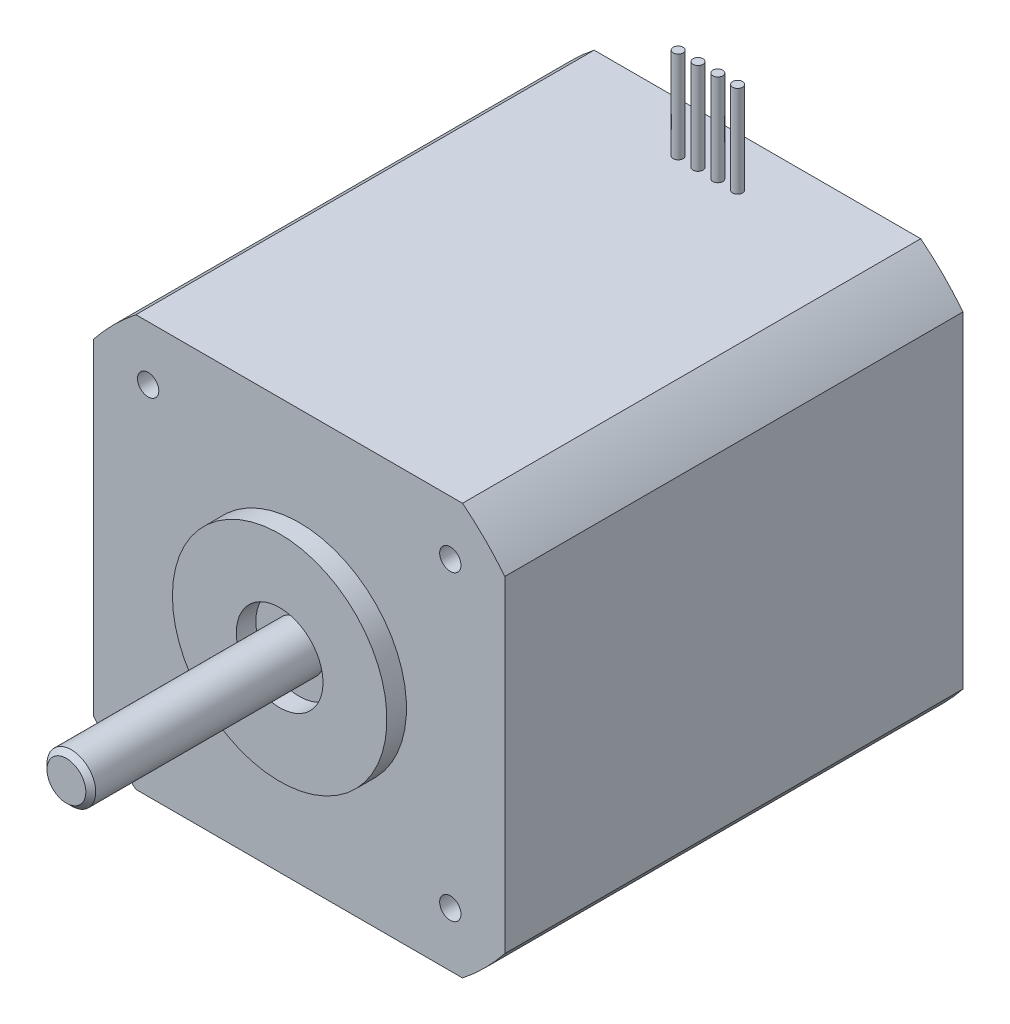
ISO-10303-21;
HEADER;
FILE_DESCRIPTION(('STEP AP214'),'2;1');
FILE_NAME('part.step','',(''),(''),'','','');
FILE_SCHEMA(('AUTOMOTIVE_DESIGN { 1 0 10303 214 1 1 1 1 }'));
ENDSEC;
DATA;
#1=APPLICATION_CONTEXT('core data for automotive mechanical design processes');
#2=APPLICATION_PROTOCOL_DEFINITION('international standard','automotive_design',2000,#1);
#3=PRODUCT_CONTEXT('',#1,'mechanical');
#4=PRODUCT('Part','Part','',(#3));
#5=PRODUCT_RELATED_PRODUCT_CATEGORY('part','',(#4));
#6=PRODUCT_DEFINITION_FORMATION('','',#4);
#7=PRODUCT_DEFINITION_CONTEXT('part definition',#1,'design');
#8=PRODUCT_DEFINITION('design','',#6,#7);
#9=PRODUCT_DEFINITION_SHAPE('','',#8);
#10=(LENGTH_UNIT() NAMED_UNIT(*) SI_UNIT(.MILLI.,.METRE.));
#11=(NAMED_UNIT(*) PLANE_ANGLE_UNIT() SI_UNIT($,.RADIAN.));
#12=(NAMED_UNIT(*) SI_UNIT($,.STERADIAN.) SOLID_ANGLE_UNIT());
#13=UNCERTAINTY_MEASURE_WITH_UNIT(LENGTH_MEASURE(1.E-05),#10,'distance_accuracy_value','');
#14=(GEOMETRIC_REPRESENTATION_CONTEXT(3) GLOBAL_UNCERTAINTY_ASSIGNED_CONTEXT((#13)) GLOBAL_UNIT_ASSIGNED_CONTEXT((#10,
#11,#12)) REPRESENTATION_CONTEXT('',''));
#15=CARTESIAN_POINT('',(0.,0.,0.));
#16=DIRECTION('',(0.,0.,1.));
#17=DIRECTION('',(1.,0.,0.));
#18=AXIS2_PLACEMENT_3D('',#15,#16,#17);
#19=CARTESIAN_POINT('',(0.,0.,70.866));
#20=DIRECTION('',(0.,0.,-1.));
#21=DIRECTION('',(-1.,0.,0.));
#22=AXIS2_PLACEMENT_3D('',#19,#20,#21);
#23=PLANE('',#22);
#24=CARTESIAN_POINT('',(0.,0.,70.866000000251));
#25=DIRECTION('',(0.,0.,-1.));
#26=DIRECTION('',(-1.,0.,0.));
#27=AXIS2_PLACEMENT_3D('',#24,#25,#26);
#28=CIRCLE('',#27,1.99136000026101);
#29=CARTESIAN_POINT('',(-1.99136000026101,0.,70.866000000251));
#30=VERTEX_POINT('',#29);
#31=EDGE_CURVE('E19',#30,#30,#28,.T.);
#32=ORIENTED_EDGE('',*,*,#31,.F.);
#33=EDGE_LOOP('',(#32));
#34=FACE_BOUND('',#33,.T.);
#35=ADVANCED_FACE('F16',(#34),#23,.F.);
#36=CARTESIAN_POINT('',(0.,0.,70.3579999998283));
#37=DIRECTION('',(0.,0.,-1.));
#38=DIRECTION('',(-1.,0.,0.));
#39=AXIS2_PLACEMENT_3D('',#36,#37,#38);
#40=CONICAL_SURFACE('',#39,2.49935999977424,0.785398162502276);
#41=ORIENTED_EDGE('',*,*,#31,.T.);
#42=EDGE_LOOP('',(#41));
#43=FACE_BOUND('',#42,.T.);
#44=CARTESIAN_POINT('',(0.,0.,70.358));
#45=DIRECTION('',(0.,0.,-1.));
#46=DIRECTION('',(-1.,0.,0.));
#47=AXIS2_PLACEMENT_3D('',#44,#45,#46);
#48=CIRCLE('',#47,2.49936);
#49=CARTESIAN_POINT('',(-2.49936,0.,70.358));
#50=VERTEX_POINT('',#49);
#51=EDGE_CURVE('E120',#50,#50,#48,.T.);
#52=ORIENTED_EDGE('',*,*,#51,.F.);
#53=EDGE_LOOP('',(#52));
#54=FACE_BOUND('',#53,.T.);
#55=ADVANCED_FACE('F210',(#43,#54),#40,.T.);
#56=CARTESIAN_POINT('',(0.,0.,46.99));
#57=DIRECTION('',(0.,0.,-1.));
#58=DIRECTION('',(-1.,0.,0.));
#59=AXIS2_PLACEMENT_3D('',#56,#57,#58);
#60=CYLINDRICAL_SURFACE('',#59,2.49936);
#61=ORIENTED_EDGE('',*,*,#51,.T.);
#62=EDGE_LOOP('',(#61));
#63=FACE_BOUND('',#62,.T.);
#64=CARTESIAN_POINT('',(0.,0.,46.99));
#65=DIRECTION('',(0.,0.,-1.));
#66=DIRECTION('',(-1.,0.,0.));
#67=AXIS2_PLACEMENT_3D('',#64,#65,#66);
#68=CIRCLE('',#67,2.49936);
#69=CARTESIAN_POINT('',(-2.49936,0.,46.99));
#70=VERTEX_POINT('',#69);
#71=EDGE_CURVE('E122',#70,#70,#68,.T.);
#72=ORIENTED_EDGE('',*,*,#71,.F.);
#73=EDGE_LOOP('',(#72));
#74=FACE_BOUND('',#73,.T.);
#75=ADVANCED_FACE('F208',(#63,#74),#60,.T.);
#76=CARTESIAN_POINT('',(0.,0.,46.99));
#77=DIRECTION('',(0.,0.,1.));
#78=DIRECTION('',(1.,0.,0.));
#79=AXIS2_PLACEMENT_3D('',#76,#77,#78);
#80=PLANE('',#79);
#81=ORIENTED_EDGE('',*,*,#71,.T.);
#82=EDGE_LOOP('',(#81));
#83=FACE_BOUND('',#82,.T.);
#84=CARTESIAN_POINT('',(0.,0.,46.99));
#85=DIRECTION('',(0.,0.,-1.));
#86=DIRECTION('',(-1.,0.,0.));
#87=AXIS2_PLACEMENT_3D('',#84,#85,#86);
#88=CIRCLE('',#87,4.445);
#89=CARTESIAN_POINT('',(-4.445,0.,46.99));
#90=VERTEX_POINT('',#89);
#91=EDGE_CURVE('E200',#90,#90,#88,.F.);
#92=ORIENTED_EDGE('',*,*,#91,.T.);
#93=EDGE_LOOP('',(#92));
#94=FACE_BOUND('',#93,.T.);
#95=ADVANCED_FACE('F205',(#83,#94),#80,.T.);
#96=CARTESIAN_POINT('',(0.,0.,46.99));
#97=DIRECTION('',(0.,0.,-1.));
#98=DIRECTION('',(-1.,0.,0.));
#99=AXIS2_PLACEMENT_3D('',#96,#97,#98);
#100=CYLINDRICAL_SURFACE('',#99,4.445);
#101=CARTESIAN_POINT('',(0.,0.,48.9966));
#102=DIRECTION('',(0.,0.,-1.));
#103=DIRECTION('',(-1.,0.,0.));
#104=AXIS2_PLACEMENT_3D('',#101,#102,#103);
#105=CIRCLE('',#104,4.445);
#106=CARTESIAN_POINT('',(-4.445,0.,48.9966));
#107=VERTEX_POINT('',#106);
#108=EDGE_CURVE('E197',#107,#107,#105,.F.);
#109=ORIENTED_EDGE('',*,*,#108,.T.);
#110=EDGE_LOOP('',(#109));
#111=FACE_BOUND('',#110,.T.);
#112=ORIENTED_EDGE('',*,*,#91,.F.);
#113=EDGE_LOOP('',(#112));
#114=FACE_BOUND('',#113,.T.);
#115=ADVANCED_FACE('F218',(#111,#114),#100,.F.);
#116=CARTESIAN_POINT('',(-15.494,15.494,36.83));
#117=DIRECTION('',(0.,0.,-1.));
#118=DIRECTION('',(-1.,0.,0.));
#119=AXIS2_PLACEMENT_3D('',#116,#117,#118);
#120=PLANE('',#119);
#121=CARTESIAN_POINT('',(-15.494,15.494,36.83));
#122=DIRECTION('',(0.,0.,1.));
#123=DIRECTION('',(1.,0.,0.));
#124=AXIS2_PLACEMENT_3D('',#121,#122,#123);
#125=CIRCLE('',#124,1.0922);
#126=CARTESIAN_POINT('',(-14.4018,15.494,36.83));
#127=VERTEX_POINT('',#126);
#128=EDGE_CURVE('E194',#127,#127,#125,.T.);
#129=ORIENTED_EDGE('',*,*,#128,.T.);
#130=EDGE_LOOP('',(#129));
#131=FACE_BOUND('',#130,.T.);
#132=ADVANCED_FACE('F335',(#131),#120,.F.);
#133=CARTESIAN_POINT('',(-15.494,-15.494,36.83));
#134=DIRECTION('',(0.,0.,-1.));
#135=DIRECTION('',(-1.,0.,0.));
#136=AXIS2_PLACEMENT_3D('',#133,#134,#135);
#137=PLANE('',#136);
#138=CARTESIAN_POINT('',(-15.494,-15.494,36.83));
#139=DIRECTION('',(0.,0.,1.));
#140=DIRECTION('',(1.,0.,0.));
#141=AXIS2_PLACEMENT_3D('',#138,#139,#140);
#142=CIRCLE('',#141,1.0922);
#143=CARTESIAN_POINT('',(-14.4018,-15.494,36.83));
#144=VERTEX_POINT('',#143);
#145=EDGE_CURVE('E191',#144,#144,#142,.T.);
#146=ORIENTED_EDGE('',*,*,#145,.T.);
#147=EDGE_LOOP('',(#146));
#148=FACE_BOUND('',#147,.T.);
#149=ADVANCED_FACE('F331',(#148),#137,.F.);
#150=CARTESIAN_POINT('',(15.494,-15.494,36.83));
#151=DIRECTION('',(0.,0.,-1.));
#152=DIRECTION('',(-1.,0.,0.));
#153=AXIS2_PLACEMENT_3D('',#150,#151,#152);
#154=PLANE('',#153);
#155=CARTESIAN_POINT('',(15.494,-15.494,36.83));
#156=DIRECTION('',(0.,0.,1.));
#157=DIRECTION('',(1.,0.,0.));
#158=AXIS2_PLACEMENT_3D('',#155,#156,#157);
#159=CIRCLE('',#158,1.0922);
#160=CARTESIAN_POINT('',(16.5862,-15.494,36.83));
#161=VERTEX_POINT('',#160);
#162=EDGE_CURVE('E188',#161,#161,#159,.T.);
#163=ORIENTED_EDGE('',*,*,#162,.T.);
#164=EDGE_LOOP('',(#163));
#165=FACE_BOUND('',#164,.T.);
#166=ADVANCED_FACE('F327',(#165),#154,.F.);
#167=CARTESIAN_POINT('',(15.494,15.494,36.83));
#168=DIRECTION('',(0.,0.,-1.));
#169=DIRECTION('',(-1.,0.,0.));
#170=AXIS2_PLACEMENT_3D('',#167,#168,#169);
#171=PLANE('',#170);
#172=CARTESIAN_POINT('',(15.494,15.494,36.83));
#173=DIRECTION('',(0.,0.,1.));
#174=DIRECTION('',(1.,0.,0.));
#175=AXIS2_PLACEMENT_3D('',#172,#173,#174);
#176=CIRCLE('',#175,1.0922);
#177=CARTESIAN_POINT('',(16.5862,15.494,36.83));
#178=VERTEX_POINT('',#177);
#179=EDGE_CURVE('E185',#178,#178,#176,.T.);
#180=ORIENTED_EDGE('',*,*,#179,.T.);
#181=EDGE_LOOP('',(#180));
#182=FACE_BOUND('',#181,.T.);
#183=ADVANCED_FACE('F323',(#182),#171,.F.);
#184=CARTESIAN_POINT('',(0.,0.,48.9966));
#185=DIRECTION('',(0.,0.,-1.));
#186=DIRECTION('',(-1.,0.,0.));
#187=AXIS2_PLACEMENT_3D('',#184,#185,#186);
#188=PLANE('',#187);
#189=ORIENTED_EDGE('',*,*,#108,.F.);
#190=EDGE_LOOP('',(#189));
#191=FACE_BOUND('',#190,.T.);
#192=CARTESIAN_POINT('',(0.,0.,48.9966));
#193=DIRECTION('',(0.,0.,-1.));
#194=DIRECTION('',(-1.,0.,0.));
#195=AXIS2_PLACEMENT_3D('',#192,#193,#194);
#196=CIRCLE('',#195,10.9982);
#197=CARTESIAN_POINT('',(-10.9982,0.,48.9966));
#198=VERTEX_POINT('',#197);
#199=EDGE_CURVE('E182',#198,#198,#196,.T.);
#200=ORIENTED_EDGE('',*,*,#199,.F.);
#201=EDGE_LOOP('',(#200));
#202=FACE_BOUND('',#201,.T.);
#203=ADVANCED_FACE('F319',(#191,#202),#188,.F.);
#204=CARTESIAN_POINT('',(-1.016,30.48,5.08));
#205=DIRECTION('',(0.,-1.,0.));
#206=DIRECTION('',(0.,0.,-1.));
#207=AXIS2_PLACEMENT_3D('',#204,#205,#206);
#208=PLANE('',#207);
#209=CARTESIAN_POINT('',(-1.016,30.48,5.08));
#210=DIRECTION('',(0.,-1.,0.));
#211=DIRECTION('',(0.,0.,-1.));
#212=AXIS2_PLACEMENT_3D('',#209,#210,#211);
#213=CIRCLE('',#212,0.508);
#214=CARTESIAN_POINT('',(-1.016,30.48,4.572));
#215=VERTEX_POINT('',#214);
#216=EDGE_CURVE('E179',#215,#215,#213,.T.);
#217=ORIENTED_EDGE('',*,*,#216,.F.);
#218=EDGE_LOOP('',(#217));
#219=FACE_BOUND('',#218,.T.);
#220=ADVANCED_FACE('F315',(#219),#208,.F.);
#221=CARTESIAN_POINT('',(3.048,30.48,5.08));
#222=DIRECTION('',(0.,-1.,0.));
#223=DIRECTION('',(0.,0.,-1.));
#224=AXIS2_PLACEMENT_3D('',#221,#222,#223);
#225=PLANE('',#224);
#226=CARTESIAN_POINT('',(3.048,30.48,5.08));
#227=DIRECTION('',(0.,-1.,0.));
#228=DIRECTION('',(0.,0.,-1.));
#229=AXIS2_PLACEMENT_3D('',#226,#227,#228);
#230=CIRCLE('',#229,0.508);
#231=CARTESIAN_POINT('',(3.048,30.48,4.572));
#232=VERTEX_POINT('',#231);
#233=EDGE_CURVE('E176',#232,#232,#230,.T.);
#234=ORIENTED_EDGE('',*,*,#233,.F.);
#235=EDGE_LOOP('',(#234));
#236=FACE_BOUND('',#235,.T.);
#237=ADVANCED_FACE('F311',(#236),#225,.F.);
#238=CARTESIAN_POINT('',(1.016,30.48,5.08));
#239=DIRECTION('',(0.,-1.,0.));
#240=DIRECTION('',(0.,0.,-1.));
#241=AXIS2_PLACEMENT_3D('',#238,#239,#240);
#242=PLANE('',#241);
#243=CARTESIAN_POINT('',(1.016,30.48,5.08));
#244=DIRECTION('',(0.,-1.,0.));
#245=DIRECTION('',(0.,0.,-1.));
#246=AXIS2_PLACEMENT_3D('',#243,#244,#245);
#247=CIRCLE('',#246,0.508);
#248=CARTESIAN_POINT('',(1.016,30.48,4.572));
#249=VERTEX_POINT('',#248);
#250=EDGE_CURVE('E173',#249,#249,#247,.T.);
#251=ORIENTED_EDGE('',*,*,#250,.F.);
#252=EDGE_LOOP('',(#251));
#253=FACE_BOUND('',#252,.T.);
#254=ADVANCED_FACE('F307',(#253),#242,.F.);
#255=CARTESIAN_POINT('',(-3.048,30.48,5.08));
#256=DIRECTION('',(0.,-1.,0.));
#257=DIRECTION('',(0.,0.,-1.));
#258=AXIS2_PLACEMENT_3D('',#255,#256,#257);
#259=PLANE('',#258);
#260=CARTESIAN_POINT('',(-3.048,30.48,5.08));
#261=DIRECTION('',(0.,-1.,0.));
#262=DIRECTION('',(0.,0.,-1.));
#263=AXIS2_PLACEMENT_3D('',#260,#261,#262);
#264=CIRCLE('',#263,0.508);
#265=CARTESIAN_POINT('',(-3.048,30.48,4.572));
#266=VERTEX_POINT('',#265);
#267=EDGE_CURVE('E170',#266,#266,#264,.T.);
#268=ORIENTED_EDGE('',*,*,#267,.F.);
#269=EDGE_LOOP('',(#268));
#270=FACE_BOUND('',#269,.T.);
#271=ADVANCED_FACE('F303',(#270),#259,.F.);
#272=CARTESIAN_POINT('',(-15.494,15.494,49.53));
#273=DIRECTION('',(0.,0.,1.));
#274=DIRECTION('',(1.,0.,0.));
#275=AXIS2_PLACEMENT_3D('',#272,#273,#274);
#276=CYLINDRICAL_SURFACE('',#275,1.0922);
#277=ORIENTED_EDGE('',*,*,#128,.F.);
#278=EDGE_LOOP('',(#277));
#279=FACE_BOUND('',#278,.T.);
#280=CARTESIAN_POINT('',(-15.494,15.494,46.99));
#281=DIRECTION('',(0.,0.,1.));
#282=DIRECTION('',(1.,0.,0.));
#283=AXIS2_PLACEMENT_3D('',#280,#281,#282);
#284=CIRCLE('',#283,1.0922);
#285=CARTESIAN_POINT('',(-14.4018,15.494,46.99));
#286=VERTEX_POINT('',#285);
#287=EDGE_CURVE('E167',#286,#286,#284,.F.);
#288=ORIENTED_EDGE('',*,*,#287,.F.);
#289=EDGE_LOOP('',(#288));
#290=FACE_BOUND('',#289,.T.);
#291=ADVANCED_FACE('F299',(#279,#290),#276,.F.);
#292=CARTESIAN_POINT('',(-15.494,-15.494,49.53));
#293=DIRECTION('',(0.,0.,1.));
#294=DIRECTION('',(1.,0.,0.));
#295=AXIS2_PLACEMENT_3D('',#292,#293,#294);
#296=CYLINDRICAL_SURFACE('',#295,1.0922);
#297=ORIENTED_EDGE('',*,*,#145,.F.);
#298=EDGE_LOOP('',(#297));
#299=FACE_BOUND('',#298,.T.);
#300=CARTESIAN_POINT('',(-15.494,-15.494,46.99));
#301=DIRECTION('',(0.,0.,1.));
#302=DIRECTION('',(1.,0.,0.));
#303=AXIS2_PLACEMENT_3D('',#300,#301,#302);
#304=CIRCLE('',#303,1.0922);
#305=CARTESIAN_POINT('',(-14.4018,-15.494,46.99));
#306=VERTEX_POINT('',#305);
#307=EDGE_CURVE('E164',#306,#306,#304,.F.);
#308=ORIENTED_EDGE('',*,*,#307,.F.);
#309=EDGE_LOOP('',(#308));
#310=FACE_BOUND('',#309,.T.);
#311=ADVANCED_FACE('F295',(#299,#310),#296,.F.);
#312=CARTESIAN_POINT('',(15.494,-15.494,49.53));
#313=DIRECTION('',(0.,0.,1.));
#314=DIRECTION('',(1.,0.,0.));
#315=AXIS2_PLACEMENT_3D('',#312,#313,#314);
#316=CYLINDRICAL_SURFACE('',#315,1.0922);
#317=ORIENTED_EDGE('',*,*,#162,.F.);
#318=EDGE_LOOP('',(#317));
#319=FACE_BOUND('',#318,.T.);
#320=CARTESIAN_POINT('',(15.494,-15.494,46.99));
#321=DIRECTION('',(0.,0.,1.));
#322=DIRECTION('',(1.,0.,0.));
#323=AXIS2_PLACEMENT_3D('',#320,#321,#322);
#324=CIRCLE('',#323,1.0922);
#325=CARTESIAN_POINT('',(16.5862,-15.494,46.99));
#326=VERTEX_POINT('',#325);
#327=EDGE_CURVE('E161',#326,#326,#324,.F.);
#328=ORIENTED_EDGE('',*,*,#327,.F.);
#329=EDGE_LOOP('',(#328));
#330=FACE_BOUND('',#329,.T.);
#331=ADVANCED_FACE('F291',(#319,#330),#316,.F.);
#332=CARTESIAN_POINT('',(15.494,15.494,49.53));
#333=DIRECTION('',(0.,0.,1.));
#334=DIRECTION('',(1.,0.,0.));
#335=AXIS2_PLACEMENT_3D('',#332,#333,#334);
#336=CYLINDRICAL_SURFACE('',#335,1.0922);
#337=ORIENTED_EDGE('',*,*,#179,.F.);
#338=EDGE_LOOP('',(#337));
#339=FACE_BOUND('',#338,.T.);
#340=CARTESIAN_POINT('',(15.494,15.494,46.99));
#341=DIRECTION('',(0.,0.,1.));
#342=DIRECTION('',(1.,0.,0.));
#343=AXIS2_PLACEMENT_3D('',#340,#341,#342);
#344=CIRCLE('',#343,1.0922);
#345=CARTESIAN_POINT('',(16.5862,15.494,46.99));
#346=VERTEX_POINT('',#345);
#347=EDGE_CURVE('E158',#346,#346,#344,.F.);
#348=ORIENTED_EDGE('',*,*,#347,.F.);
#349=EDGE_LOOP('',(#348));
#350=FACE_BOUND('',#349,.T.);
#351=ADVANCED_FACE('F287',(#339,#350),#336,.F.);
#352=CARTESIAN_POINT('',(0.,0.,46.99));
#353=DIRECTION('',(0.,0.,-1.));
#354=DIRECTION('',(-1.,0.,0.));
#355=AXIS2_PLACEMENT_3D('',#352,#353,#354);
#356=CYLINDRICAL_SURFACE('',#355,10.9982);
#357=ORIENTED_EDGE('',*,*,#199,.T.);
#358=EDGE_LOOP('',(#357));
#359=FACE_BOUND('',#358,.T.);
#360=CARTESIAN_POINT('',(0.,0.,46.99));
#361=DIRECTION('',(0.,0.,-1.));
#362=DIRECTION('',(-1.,0.,0.));
#363=AXIS2_PLACEMENT_3D('',#360,#361,#362);
#364=CIRCLE('',#363,10.9982);
#365=CARTESIAN_POINT('',(-10.9982,0.,46.99));
#366=VERTEX_POINT('',#365);
#367=EDGE_CURVE('E99',#366,#366,#364,.T.);
#368=ORIENTED_EDGE('',*,*,#367,.F.);
#369=EDGE_LOOP('',(#368));
#370=FACE_BOUND('',#369,.T.);
#371=ADVANCED_FACE('F283',(#359,#370),#356,.T.);
#372=CARTESIAN_POINT('',(-1.016,0.,5.08));
#373=DIRECTION('',(0.,-1.,0.));
#374=DIRECTION('',(0.,0.,-1.));
#375=AXIS2_PLACEMENT_3D('',#372,#373,#374);
#376=CYLINDRICAL_SURFACE('',#375,0.508);
#377=ORIENTED_EDGE('',*,*,#216,.T.);
#378=EDGE_LOOP('',(#377));
#379=FACE_BOUND('',#378,.T.);
#380=CARTESIAN_POINT('',(-1.016,21.082,5.08));
#381=DIRECTION('',(0.,-1.,0.));
#382=DIRECTION('',(0.,0.,-1.));
#383=AXIS2_PLACEMENT_3D('',#380,#381,#382);
#384=CIRCLE('',#383,0.508);
#385=CARTESIAN_POINT('',(-1.016,21.082,4.572));
#386=VERTEX_POINT('',#385);
#387=EDGE_CURVE('E116',#386,#386,#384,.T.);
#388=ORIENTED_EDGE('',*,*,#387,.F.);
#389=EDGE_LOOP('',(#388));
#390=FACE_BOUND('',#389,.T.);
#391=ADVANCED_FACE('F279',(#379,#390),#376,.T.);
#392=CARTESIAN_POINT('',(3.048,0.,5.08));
#393=DIRECTION('',(0.,-1.,0.));
#394=DIRECTION('',(0.,0.,-1.));
#395=AXIS2_PLACEMENT_3D('',#392,#393,#394);
#396=CYLINDRICAL_SURFACE('',#395,0.508);
#397=ORIENTED_EDGE('',*,*,#233,.T.);
#398=EDGE_LOOP('',(#397));
#399=FACE_BOUND('',#398,.T.);
#400=CARTESIAN_POINT('',(3.048,21.082,5.08));
#401=DIRECTION('',(0.,-1.,0.));
#402=DIRECTION('',(0.,0.,-1.));
#403=AXIS2_PLACEMENT_3D('',#400,#401,#402);
#404=CIRCLE('',#403,0.508);
#405=CARTESIAN_POINT('',(3.048,21.082,4.572));
#406=VERTEX_POINT('',#405);
#407=EDGE_CURVE('E149',#406,#406,#404,.T.);
#408=ORIENTED_EDGE('',*,*,#407,.F.);
#409=EDGE_LOOP('',(#408));
#410=FACE_BOUND('',#409,.T.);
#411=ADVANCED_FACE('F275',(#399,#410),#396,.T.);
#412=CARTESIAN_POINT('',(1.016,0.,5.08));
#413=DIRECTION('',(0.,-1.,0.));
#414=DIRECTION('',(0.,0.,-1.));
#415=AXIS2_PLACEMENT_3D('',#412,#413,#414);
#416=CYLINDRICAL_SURFACE('',#415,0.508);
#417=ORIENTED_EDGE('',*,*,#250,.T.);
#418=EDGE_LOOP('',(#417));
#419=FACE_BOUND('',#418,.T.);
#420=CARTESIAN_POINT('',(1.016,21.082,5.08));
#421=DIRECTION('',(0.,-1.,0.));
#422=DIRECTION('',(0.,0.,-1.));
#423=AXIS2_PLACEMENT_3D('',#420,#421,#422);
#424=CIRCLE('',#423,0.508);
#425=CARTESIAN_POINT('',(1.016,21.082,4.572));
#426=VERTEX_POINT('',#425);
#427=EDGE_CURVE('E146',#426,#426,#424,.T.);
#428=ORIENTED_EDGE('',*,*,#427,.F.);
#429=EDGE_LOOP('',(#428));
#430=FACE_BOUND('',#429,.T.);
#431=ADVANCED_FACE('F271',(#419,#430),#416,.T.);
#432=CARTESIAN_POINT('',(-3.048,0.,5.08));
#433=DIRECTION('',(0.,-1.,0.));
#434=DIRECTION('',(0.,0.,-1.));
#435=AXIS2_PLACEMENT_3D('',#432,#433,#434);
#436=CYLINDRICAL_SURFACE('',#435,0.508);
#437=ORIENTED_EDGE('',*,*,#267,.T.);
#438=EDGE_LOOP('',(#437));
#439=FACE_BOUND('',#438,.T.);
#440=CARTESIAN_POINT('',(-3.048,21.082,5.08));
#441=DIRECTION('',(0.,-1.,0.));
#442=DIRECTION('',(0.,0.,-1.));
#443=AXIS2_PLACEMENT_3D('',#440,#441,#442);
#444=CIRCLE('',#443,0.508);
#445=CARTESIAN_POINT('',(-3.048,21.082,4.572));
#446=VERTEX_POINT('',#445);
#447=EDGE_CURVE('E143',#446,#446,#444,.T.);
#448=ORIENTED_EDGE('',*,*,#447,.F.);
#449=EDGE_LOOP('',(#448));
#450=FACE_BOUND('',#449,.T.);
#451=ADVANCED_FACE('F267',(#439,#450),#436,.T.);
#452=CARTESIAN_POINT('',(0.,0.,46.99));
#453=DIRECTION('',(0.,0.,1.));
#454=DIRECTION('',(1.,0.,0.));
#455=AXIS2_PLACEMENT_3D('',#452,#453,#454);
#456=PLANE('',#455);
#457=ORIENTED_EDGE('',*,*,#367,.T.);
#458=EDGE_LOOP('',(#457));
#459=FACE_BOUND('',#458,.T.);
#460=ORIENTED_EDGE('',*,*,#347,.T.);
#461=EDGE_LOOP('',(#460));
#462=FACE_BOUND('',#461,.T.);
#463=ORIENTED_EDGE('',*,*,#327,.T.);
#464=EDGE_LOOP('',(#463));
#465=FACE_BOUND('',#464,.T.);
#466=ORIENTED_EDGE('',*,*,#307,.T.);
#467=EDGE_LOOP('',(#466));
#468=FACE_BOUND('',#467,.T.);
#469=ORIENTED_EDGE('',*,*,#287,.T.);
#470=EDGE_LOOP('',(#469));
#471=FACE_BOUND('',#470,.T.);
#472=CARTESIAN_POINT('',(0.,0.,46.99));
#473=DIRECTION('',(0.,0.,-1.));
#474=DIRECTION('',(-1.,0.,0.));
#475=AXIS2_PLACEMENT_3D('',#472,#473,#474);
#476=CIRCLE('',#475,26.924);
#477=CARTESIAN_POINT('',(-21.082,16.746672863587,46.99));
#478=VERTEX_POINT('',#477);
#479=CARTESIAN_POINT('',(-16.746672863587,21.082,46.99));
#480=VERTEX_POINT('',#479);
#481=EDGE_CURVE('E141',#478,#480,#476,.T.);
#482=ORIENTED_EDGE('',*,*,#481,.F.);
#483=DIRECTION('',(0.,1.,0.));
#484=VECTOR('',#483,1.);
#485=CARTESIAN_POINT('',(-21.082,17.907,46.99));
#486=LINE('',#485,#484);
#487=CARTESIAN_POINT('',(-21.082,-16.746672863587,46.99));
#488=VERTEX_POINT('',#487);
#489=EDGE_CURVE('E109',#488,#478,#486,.T.);
#490=ORIENTED_EDGE('',*,*,#489,.F.);
#491=CARTESIAN_POINT('',(0.,0.,46.99));
#492=DIRECTION('',(0.,0.,-1.));
#493=DIRECTION('',(-1.,0.,0.));
#494=AXIS2_PLACEMENT_3D('',#491,#492,#493);
#495=CIRCLE('',#494,26.924);
#496=CARTESIAN_POINT('',(-16.746672863587,-21.082,46.99));
#497=VERTEX_POINT('',#496);
#498=EDGE_CURVE('E95',#497,#488,#495,.T.);
#499=ORIENTED_EDGE('',*,*,#498,.F.);
#500=DIRECTION('',(1.,0.,0.));
#501=VECTOR('',#500,1.);
#502=CARTESIAN_POINT('',(-17.907,-21.082,46.99));
#503=LINE('',#502,#501);
#504=CARTESIAN_POINT('',(16.746672863587,-21.082,46.99));
#505=VERTEX_POINT('',#504);
#506=EDGE_CURVE('E89',#505,#497,#503,.F.);
#507=ORIENTED_EDGE('',*,*,#506,.F.);
#508=CARTESIAN_POINT('',(0.,0.,46.99));
#509=DIRECTION('',(0.,0.,-1.));
#510=DIRECTION('',(-1.,0.,0.));
#511=AXIS2_PLACEMENT_3D('',#508,#509,#510);
#512=CIRCLE('',#511,26.924);
#513=CARTESIAN_POINT('',(21.082,-16.746672863587,46.99));
#514=VERTEX_POINT('',#513);
#515=EDGE_CURVE('E79',#514,#505,#512,.T.);
#516=ORIENTED_EDGE('',*,*,#515,.F.);
#517=DIRECTION('',(0.,1.,0.));
#518=VECTOR('',#517,1.);
#519=CARTESIAN_POINT('',(21.082,-17.907,46.99));
#520=LINE('',#519,#518);
#521=CARTESIAN_POINT('',(21.082,16.746672863587,46.99));
#522=VERTEX_POINT('',#521);
#523=EDGE_CURVE('E105',#522,#514,#520,.F.);
#524=ORIENTED_EDGE('',*,*,#523,.F.);
#525=CARTESIAN_POINT('',(0.,0.,46.99));
#526=DIRECTION('',(0.,0.,-1.));
#527=DIRECTION('',(-1.,0.,0.));
#528=AXIS2_PLACEMENT_3D('',#525,#526,#527);
#529=CIRCLE('',#528,26.924);
#530=CARTESIAN_POINT('',(16.746672863587,21.082,46.99));
#531=VERTEX_POINT('',#530);
#532=EDGE_CURVE('E119',#531,#522,#529,.T.);
#533=ORIENTED_EDGE('',*,*,#532,.F.);
#534=DIRECTION('',(1.,0.,0.));
#535=VECTOR('',#534,1.);
#536=CARTESIAN_POINT('',(17.907,21.082,46.99));
#537=LINE('',#536,#535);
#538=EDGE_CURVE('E113',#480,#531,#537,.T.);
#539=ORIENTED_EDGE('',*,*,#538,.F.);
#540=EDGE_LOOP('',(#482,#490,#499,#507,#516,#524,#533,#539));
#541=FACE_BOUND('',#540,.T.);
#542=ADVANCED_FACE('F93',(#459,#462,#465,#468,#471,#541),#456,.T.);
#543=CARTESIAN_POINT('',(0.,0.,0.254));
#544=DIRECTION('',(0.,0.,1.));
#545=DIRECTION('',(1.,0.,0.));
#546=AXIS2_PLACEMENT_3D('',#543,#544,#545);
#547=PLANE('',#546);
#548=CARTESIAN_POINT('',(0.,0.,0.253999999999997));
#549=DIRECTION('',(0.,0.,1.));
#550=DIRECTION('',(1.,0.,0.));
#551=AXIS2_PLACEMENT_3D('',#548,#549,#550);
#552=CIRCLE('',#551,4.445);
#553=CARTESIAN_POINT('',(4.445,0.,0.253999999999997));
#554=VERTEX_POINT('',#553);
#555=EDGE_CURVE('E136',#554,#554,#552,.F.);
#556=ORIENTED_EDGE('',*,*,#555,.T.);
#557=EDGE_LOOP('',(#556));
#558=FACE_BOUND('',#557,.T.);
#559=ADVANCED_FACE('F261',(#558),#547,.F.);
#560=CARTESIAN_POINT('',(-17.907,-21.082,46.99));
#561=DIRECTION('',(0.,-1.,0.));
#562=DIRECTION('',(0.,0.,-1.));
#563=AXIS2_PLACEMENT_3D('',#560,#561,#562);
#564=PLANE('',#563);
#565=DIRECTION('',(0.,0.,-1.));
#566=VECTOR('',#565,1.);
#567=CARTESIAN_POINT('',(16.746672863587,-21.082,0.));
#568=LINE('',#567,#566);
#569=CARTESIAN_POINT('',(16.746672863587,-21.082,0.));
#570=VERTEX_POINT('',#569);
#571=EDGE_CURVE('E86',#505,#570,#568,.T.);
#572=ORIENTED_EDGE('',*,*,#571,.F.);
#573=ORIENTED_EDGE('',*,*,#506,.T.);
#574=DIRECTION('',(0.,0.,-1.));
#575=VECTOR('',#574,1.);
#576=CARTESIAN_POINT('',(-16.746672863587,-21.082,0.));
#577=LINE('',#576,#575);
#578=CARTESIAN_POINT('',(-16.746672863587,-21.082,0.));
#579=VERTEX_POINT('',#578);
#580=EDGE_CURVE('E140',#579,#497,#577,.F.);
#581=ORIENTED_EDGE('',*,*,#580,.F.);
#582=DIRECTION('',(1.,0.,0.));
#583=VECTOR('',#582,1.);
#584=CARTESIAN_POINT('',(0.,-21.082,0.));
#585=LINE('',#584,#583);
#586=EDGE_CURVE('E103',#579,#570,#585,.T.);
#587=ORIENTED_EDGE('',*,*,#586,.T.);
#588=EDGE_LOOP('',(#572,#573,#581,#587));
#589=FACE_BOUND('',#588,.T.);
#590=ADVANCED_FACE('F102',(#589),#564,.T.);
#591=CARTESIAN_POINT('',(0.,0.,0.));
#592=DIRECTION('',(0.,0.,-1.));
#593=DIRECTION('',(-1.,0.,0.));
#594=AXIS2_PLACEMENT_3D('',#591,#592,#593);
#595=CYLINDRICAL_SURFACE('',#594,26.924);
#596=ORIENTED_EDGE('',*,*,#571,.T.);
#597=CARTESIAN_POINT('',(0.,0.,0.));
#598=DIRECTION('',(0.,0.,-1.));
#599=DIRECTION('',(-1.,0.,0.));
#600=AXIS2_PLACEMENT_3D('',#597,#598,#599);
#601=CIRCLE('',#600,26.924);
#602=CARTESIAN_POINT('',(21.082,-16.746672863587,0.));
#603=VERTEX_POINT('',#602);
#604=EDGE_CURVE('E134',#570,#603,#601,.F.);
#605=ORIENTED_EDGE('',*,*,#604,.T.);
#606=DIRECTION('',(0.,0.,-1.));
#607=VECTOR('',#606,1.);
#608=CARTESIAN_POINT('',(21.082,-16.746672863587,46.99));
#609=LINE('',#608,#607);
#610=EDGE_CURVE('E88',#514,#603,#609,.T.);
#611=ORIENTED_EDGE('',*,*,#610,.F.);
#612=ORIENTED_EDGE('',*,*,#515,.T.);
#613=EDGE_LOOP('',(#596,#605,#611,#612));
#614=FACE_BOUND('',#613,.T.);
#615=ADVANCED_FACE('F83',(#614),#595,.T.);
#616=CARTESIAN_POINT('',(21.082,-17.907,46.99));
#617=DIRECTION('',(1.,0.,0.));
#618=DIRECTION('',(0.,0.,-1.));
#619=AXIS2_PLACEMENT_3D('',#616,#617,#618);
#620=PLANE('',#619);
#621=DIRECTION('',(0.,0.,-1.));
#622=VECTOR('',#621,1.);
#623=CARTESIAN_POINT('',(21.082,16.746672863587,0.));
#624=LINE('',#623,#622);
#625=CARTESIAN_POINT('',(21.082,16.746672863587,0.));
#626=VERTEX_POINT('',#625);
#627=EDGE_CURVE('E154',#522,#626,#624,.T.);
#628=ORIENTED_EDGE('',*,*,#627,.F.);
#629=ORIENTED_EDGE('',*,*,#523,.T.);
#630=ORIENTED_EDGE('',*,*,#610,.T.);
#631=DIRECTION('',(0.,1.,0.));
#632=VECTOR('',#631,1.);
#633=CARTESIAN_POINT('',(21.082,0.,0.));
#634=LINE('',#633,#632);
#635=EDGE_CURVE('E133',#603,#626,#634,.T.);
#636=ORIENTED_EDGE('',*,*,#635,.T.);
#637=EDGE_LOOP('',(#628,#629,#630,#636));
#638=FACE_BOUND('',#637,.T.);
#639=ADVANCED_FACE('F252',(#638),#620,.T.);
#640=CARTESIAN_POINT('',(0.,0.,0.));
#641=DIRECTION('',(0.,0.,-1.));
#642=DIRECTION('',(-1.,0.,0.));
#643=AXIS2_PLACEMENT_3D('',#640,#641,#642);
#644=CYLINDRICAL_SURFACE('',#643,26.924);
#645=ORIENTED_EDGE('',*,*,#627,.T.);
#646=CARTESIAN_POINT('',(0.,0.,0.));
#647=DIRECTION('',(0.,0.,-1.));
#648=DIRECTION('',(-1.,0.,0.));
#649=AXIS2_PLACEMENT_3D('',#646,#647,#648);
#650=CIRCLE('',#649,26.924);
#651=CARTESIAN_POINT('',(16.746672863587,21.082,0.));
#652=VERTEX_POINT('',#651);
#653=EDGE_CURVE('E130',#626,#652,#650,.F.);
#654=ORIENTED_EDGE('',*,*,#653,.T.);
#655=DIRECTION('',(0.,0.,1.));
#656=VECTOR('',#655,1.);
#657=CARTESIAN_POINT('',(16.746672863587,21.082,46.99));
#658=LINE('',#657,#656);
#659=EDGE_CURVE('E117',#531,#652,#658,.F.);
#660=ORIENTED_EDGE('',*,*,#659,.F.);
#661=ORIENTED_EDGE('',*,*,#532,.T.);
#662=EDGE_LOOP('',(#645,#654,#660,#661));
#663=FACE_BOUND('',#662,.T.);
#664=ADVANCED_FACE('F248',(#663),#644,.T.);
#665=CARTESIAN_POINT('',(17.907,21.082,46.99));
#666=DIRECTION('',(0.,1.,0.));
#667=DIRECTION('',(0.,0.,1.));
#668=AXIS2_PLACEMENT_3D('',#665,#666,#667);
#669=PLANE('',#668);
#670=ORIENTED_EDGE('',*,*,#447,.T.);
#671=EDGE_LOOP('',(#670));
#672=FACE_BOUND('',#671,.T.);
#673=ORIENTED_EDGE('',*,*,#427,.T.);
#674=EDGE_LOOP('',(#673));
#675=FACE_BOUND('',#674,.T.);
#676=ORIENTED_EDGE('',*,*,#407,.T.);
#677=EDGE_LOOP('',(#676));
#678=FACE_BOUND('',#677,.T.);
#679=ORIENTED_EDGE('',*,*,#387,.T.);
#680=EDGE_LOOP('',(#679));
#681=FACE_BOUND('',#680,.T.);
#682=DIRECTION('',(0.,0.,-1.));
#683=VECTOR('',#682,1.);
#684=CARTESIAN_POINT('',(-16.746672863587,21.082,0.));
#685=LINE('',#684,#683);
#686=CARTESIAN_POINT('',(-16.746672863587,21.082,0.));
#687=VERTEX_POINT('',#686);
#688=EDGE_CURVE('E111',#480,#687,#685,.T.);
#689=ORIENTED_EDGE('',*,*,#688,.F.);
#690=ORIENTED_EDGE('',*,*,#538,.T.);
#691=ORIENTED_EDGE('',*,*,#659,.T.);
#692=DIRECTION('',(1.,0.,0.));
#693=VECTOR('',#692,1.);
#694=CARTESIAN_POINT('',(0.,21.082,0.));
#695=LINE('',#694,#693);
#696=EDGE_CURVE('E129',#652,#687,#695,.F.);
#697=ORIENTED_EDGE('',*,*,#696,.T.);
#698=EDGE_LOOP('',(#689,#690,#691,#697));
#699=FACE_BOUND('',#698,.T.);
#700=ADVANCED_FACE('F244',(#672,#675,#678,#681,#699),#669,.T.);
#701=CARTESIAN_POINT('',(0.,0.,0.));
#702=DIRECTION('',(0.,0.,-1.));
#703=DIRECTION('',(-1.,0.,0.));
#704=AXIS2_PLACEMENT_3D('',#701,#702,#703);
#705=CYLINDRICAL_SURFACE('',#704,26.924);
#706=ORIENTED_EDGE('',*,*,#688,.T.);
#707=CARTESIAN_POINT('',(0.,0.,0.));
#708=DIRECTION('',(0.,0.,-1.));
#709=DIRECTION('',(-1.,0.,0.));
#710=AXIS2_PLACEMENT_3D('',#707,#708,#709);
#711=CIRCLE('',#710,26.924);
#712=CARTESIAN_POINT('',(-21.082,16.746672863587,0.));
#713=VERTEX_POINT('',#712);
#714=EDGE_CURVE('E126',#687,#713,#711,.F.);
#715=ORIENTED_EDGE('',*,*,#714,.T.);
#716=DIRECTION('',(0.,0.,1.));
#717=VECTOR('',#716,1.);
#718=CARTESIAN_POINT('',(-21.082,16.746672863587,46.99));
#719=LINE('',#718,#717);
#720=EDGE_CURVE('E110',#478,#713,#719,.F.);
#721=ORIENTED_EDGE('',*,*,#720,.F.);
#722=ORIENTED_EDGE('',*,*,#481,.T.);
#723=EDGE_LOOP('',(#706,#715,#721,#722));
#724=FACE_BOUND('',#723,.T.);
#725=ADVANCED_FACE('F240',(#724),#705,.T.);
#726=CARTESIAN_POINT('',(-21.082,17.907,46.99));
#727=DIRECTION('',(-1.,0.,0.));
#728=DIRECTION('',(0.,0.,1.));
#729=AXIS2_PLACEMENT_3D('',#726,#727,#728);
#730=PLANE('',#729);
#731=ORIENTED_EDGE('',*,*,#720,.T.);
#732=DIRECTION('',(0.,1.,0.));
#733=VECTOR('',#732,1.);
#734=CARTESIAN_POINT('',(-21.082,0.,0.));
#735=LINE('',#734,#733);
#736=CARTESIAN_POINT('',(-21.082,-16.746672863587,0.));
#737=VERTEX_POINT('',#736);
#738=EDGE_CURVE('E125',#713,#737,#735,.F.);
#739=ORIENTED_EDGE('',*,*,#738,.T.);
#740=DIRECTION('',(0.,0.,-1.));
#741=VECTOR('',#740,1.);
#742=CARTESIAN_POINT('',(-21.082,-16.746672863587,0.));
#743=LINE('',#742,#741);
#744=EDGE_CURVE('E34',#488,#737,#743,.T.);
#745=ORIENTED_EDGE('',*,*,#744,.F.);
#746=ORIENTED_EDGE('',*,*,#489,.T.);
#747=EDGE_LOOP('',(#731,#739,#745,#746));
#748=FACE_BOUND('',#747,.T.);
#749=ADVANCED_FACE('F237',(#748),#730,.T.);
#750=CARTESIAN_POINT('',(0.,0.,0.));
#751=DIRECTION('',(0.,0.,-1.));
#752=DIRECTION('',(-1.,0.,0.));
#753=AXIS2_PLACEMENT_3D('',#750,#751,#752);
#754=CYLINDRICAL_SURFACE('',#753,26.924);
#755=ORIENTED_EDGE('',*,*,#744,.T.);
#756=CARTESIAN_POINT('',(0.,0.,0.));
#757=DIRECTION('',(0.,0.,-1.));
#758=DIRECTION('',(-1.,0.,0.));
#759=AXIS2_PLACEMENT_3D('',#756,#757,#758);
#760=CIRCLE('',#759,26.924);
#761=EDGE_CURVE('E25',#737,#579,#760,.F.);
#762=ORIENTED_EDGE('',*,*,#761,.T.);
#763=ORIENTED_EDGE('',*,*,#580,.T.);
#764=ORIENTED_EDGE('',*,*,#498,.T.);
#765=EDGE_LOOP('',(#755,#762,#763,#764));
#766=FACE_BOUND('',#765,.T.);
#767=ADVANCED_FACE('F229',(#766),#754,.T.);
#768=CARTESIAN_POINT('',(0.,0.,46.99));
#769=DIRECTION('',(0.,0.,1.));
#770=DIRECTION('',(1.,0.,0.));
#771=AXIS2_PLACEMENT_3D('',#768,#769,#770);
#772=CYLINDRICAL_SURFACE('',#771,4.445);
#773=ORIENTED_EDGE('',*,*,#555,.F.);
#774=EDGE_LOOP('',(#773));
#775=FACE_BOUND('',#774,.T.);
#776=CARTESIAN_POINT('',(0.,0.,0.));
#777=DIRECTION('',(0.,0.,1.));
#778=DIRECTION('',(1.,0.,0.));
#779=AXIS2_PLACEMENT_3D('',#776,#777,#778);
#780=CIRCLE('',#779,4.445);
#781=CARTESIAN_POINT('',(4.445,0.,0.));
#782=VERTEX_POINT('',#781);
#783=EDGE_CURVE('E10',#782,#782,#780,.F.);
#784=ORIENTED_EDGE('',*,*,#783,.T.);
#785=EDGE_LOOP('',(#784));
#786=FACE_BOUND('',#785,.T.);
#787=ADVANCED_FACE('F223',(#775,#786),#772,.F.);
#788=CARTESIAN_POINT('',(0.,0.,0.));
#789=DIRECTION('',(0.,0.,1.));
#790=DIRECTION('',(1.,0.,0.));
#791=AXIS2_PLACEMENT_3D('',#788,#789,#790);
#792=PLANE('',#791);
#793=ORIENTED_EDGE('',*,*,#783,.F.);
#794=EDGE_LOOP('',(#793));
#795=FACE_BOUND('',#794,.T.);
#796=ORIENTED_EDGE('',*,*,#738,.F.);
#797=ORIENTED_EDGE('',*,*,#714,.F.);
#798=ORIENTED_EDGE('',*,*,#696,.F.);
#799=ORIENTED_EDGE('',*,*,#653,.F.);
#800=ORIENTED_EDGE('',*,*,#635,.F.);
#801=ORIENTED_EDGE('',*,*,#604,.F.);
#802=ORIENTED_EDGE('',*,*,#586,.F.);
#803=ORIENTED_EDGE('',*,*,#761,.F.);
#804=EDGE_LOOP('',(#796,#797,#798,#799,#800,#801,#802,#803));
#805=FACE_BOUND('',#804,.T.);
#806=ADVANCED_FACE('F221',(#795,#805),#792,.F.);
#807=CLOSED_SHELL('',(#35,#55,#75,#95,#115,#132,#149,#166,#183,#203,#220,#237,#254,#271,#291,
#311,#331,#351,#371,#391,#411,#431,#451,#542,#559,#590,#615,#639,#664,#700,#725,#749,#767,#787,#806));
#808=MANIFOLD_SOLID_BREP('B1',#807);
#809=ADVANCED_BREP_SHAPE_REPRESENTATION('',(#18,#808),#14);
#810=SHAPE_DEFINITION_REPRESENTATION(#9,#809);
ENDSEC;
END-ISO-10303-21;
